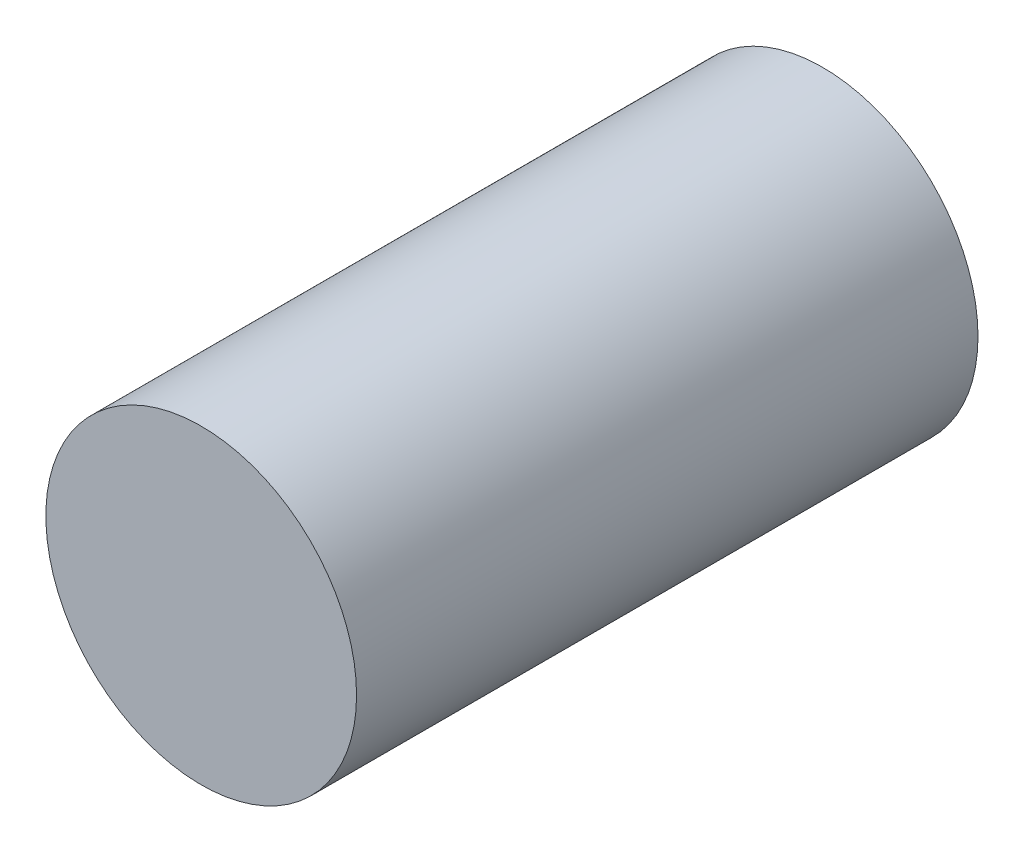
ISO-10303-21;
HEADER;
FILE_DESCRIPTION(('STEP AP214'),'2;1');
FILE_NAME('part.step','',(''),(''),'','','');
FILE_SCHEMA(('AUTOMOTIVE_DESIGN { 1 0 10303 214 1 1 1 1 }'));
ENDSEC;
DATA;
#1=APPLICATION_CONTEXT('core data for automotive mechanical design processes');
#2=APPLICATION_PROTOCOL_DEFINITION('international standard','automotive_design',2000,#1);
#3=PRODUCT_CONTEXT('',#1,'mechanical');
#4=PRODUCT('Part','Part','',(#3));
#5=PRODUCT_RELATED_PRODUCT_CATEGORY('part','',(#4));
#6=PRODUCT_DEFINITION_FORMATION('','',#4);
#7=PRODUCT_DEFINITION_CONTEXT('part definition',#1,'design');
#8=PRODUCT_DEFINITION('design','',#6,#7);
#9=PRODUCT_DEFINITION_SHAPE('','',#8);
#10=(LENGTH_UNIT() NAMED_UNIT(*) SI_UNIT(.MILLI.,.METRE.));
#11=(NAMED_UNIT(*) PLANE_ANGLE_UNIT() SI_UNIT($,.RADIAN.));
#12=(NAMED_UNIT(*) SI_UNIT($,.STERADIAN.) SOLID_ANGLE_UNIT());
#13=UNCERTAINTY_MEASURE_WITH_UNIT(LENGTH_MEASURE(1.E-05),#10,'distance_accuracy_value','');
#14=(GEOMETRIC_REPRESENTATION_CONTEXT(3) GLOBAL_UNCERTAINTY_ASSIGNED_CONTEXT((#13)) GLOBAL_UNIT_ASSIGNED_CONTEXT((#10,
#11,#12)) REPRESENTATION_CONTEXT('',''));
#15=CARTESIAN_POINT('',(0.,0.,0.));
#16=DIRECTION('',(0.,0.,1.));
#17=DIRECTION('',(1.,0.,0.));
#18=AXIS2_PLACEMENT_3D('',#15,#16,#17);
#19=CARTESIAN_POINT('',(0.,0.,12.));
#20=DIRECTION('',(0.,0.,-1.));
#21=DIRECTION('',(-1.,0.,0.));
#22=AXIS2_PLACEMENT_3D('',#19,#20,#21);
#23=CYLINDRICAL_SURFACE('',#22,6.);
#24=CARTESIAN_POINT('',(0.,0.,12.));
#25=DIRECTION('',(0.,0.,1.));
#26=DIRECTION('',(1.,0.,0.));
#27=AXIS2_PLACEMENT_3D('',#24,#25,#26);
#28=CIRCLE('',#27,6.);
#29=CARTESIAN_POINT('',(6.,0.,12.));
#30=VERTEX_POINT('',#29);
#31=EDGE_CURVE('E10',#30,#30,#28,.T.);
#32=ORIENTED_EDGE('',*,*,#31,.F.);
#33=EDGE_LOOP('',(#32));
#34=FACE_BOUND('',#33,.T.);
#35=CARTESIAN_POINT('',(0.,0.,-12.));
#36=DIRECTION('',(0.,0.,1.));
#37=DIRECTION('',(1.,0.,0.));
#38=AXIS2_PLACEMENT_3D('',#35,#36,#37);
#39=CIRCLE('',#38,6.);
#40=CARTESIAN_POINT('',(6.,0.,-12.));
#41=VERTEX_POINT('',#40);
#42=EDGE_CURVE('E36',#41,#41,#39,.T.);
#43=ORIENTED_EDGE('',*,*,#42,.T.);
#44=EDGE_LOOP('',(#43));
#45=FACE_BOUND('',#44,.T.);
#46=ADVANCED_FACE('F34',(#34,#45),#23,.T.);
#47=CARTESIAN_POINT('',(0.,0.,12.));
#48=DIRECTION('',(0.,0.,1.));
#49=DIRECTION('',(1.,0.,0.));
#50=AXIS2_PLACEMENT_3D('',#47,#48,#49);
#51=PLANE('',#50);
#52=ORIENTED_EDGE('',*,*,#31,.T.);
#53=EDGE_LOOP('',(#52));
#54=FACE_BOUND('',#53,.T.);
#55=ADVANCED_FACE('F53',(#54),#51,.T.);
#56=CARTESIAN_POINT('',(0.,0.,-12.));
#57=DIRECTION('',(0.,0.,1.));
#58=DIRECTION('',(1.,0.,0.));
#59=AXIS2_PLACEMENT_3D('',#56,#57,#58);
#60=PLANE('',#59);
#61=ORIENTED_EDGE('',*,*,#42,.F.);
#62=EDGE_LOOP('',(#61));
#63=FACE_BOUND('',#62,.T.);
#64=ADVANCED_FACE('F55',(#63),#60,.F.);
#65=CLOSED_SHELL('',(#46,#55,#64));
#66=MANIFOLD_SOLID_BREP('B2',#65);
#67=ADVANCED_BREP_SHAPE_REPRESENTATION('',(#18,#66),#14);
#68=SHAPE_DEFINITION_REPRESENTATION(#9,#67);
ENDSEC;
END-ISO-10303-21;
